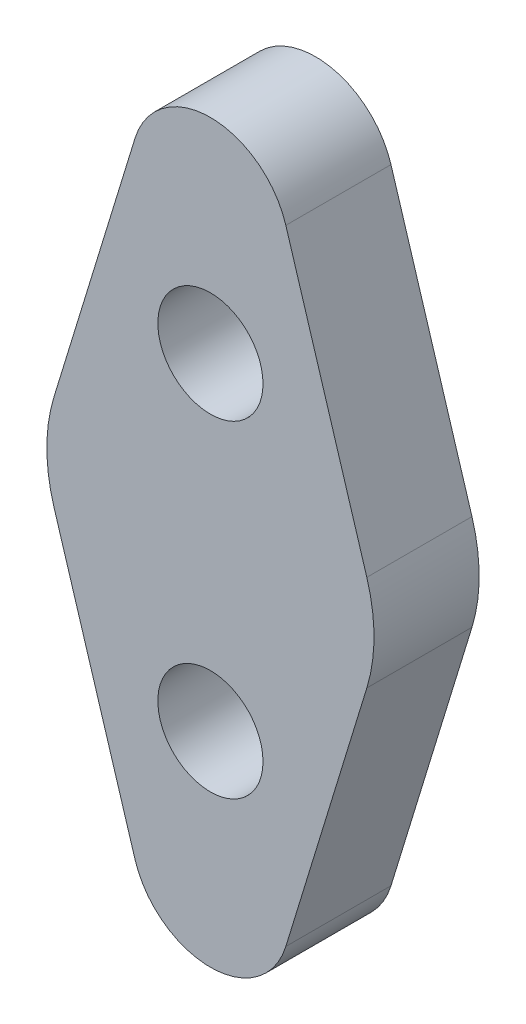
ISO-10303-21;
HEADER;
FILE_DESCRIPTION(('STEP AP214'),'2;1');
FILE_NAME('part.step','',(''),(''),'','','');
FILE_SCHEMA(('AUTOMOTIVE_DESIGN { 1 0 10303 214 1 1 1 1 }'));
ENDSEC;
DATA;
#1=APPLICATION_CONTEXT('core data for automotive mechanical design processes');
#2=APPLICATION_PROTOCOL_DEFINITION('international standard','automotive_design',2000,#1);
#3=PRODUCT_CONTEXT('',#1,'mechanical');
#4=PRODUCT('Part','Part','',(#3));
#5=PRODUCT_RELATED_PRODUCT_CATEGORY('part','',(#4));
#6=PRODUCT_DEFINITION_FORMATION('','',#4);
#7=PRODUCT_DEFINITION_CONTEXT('part definition',#1,'design');
#8=PRODUCT_DEFINITION('design','',#6,#7);
#9=PRODUCT_DEFINITION_SHAPE('','',#8);
#10=(LENGTH_UNIT() NAMED_UNIT(*) SI_UNIT(.MILLI.,.METRE.));
#11=(NAMED_UNIT(*) PLANE_ANGLE_UNIT() SI_UNIT($,.RADIAN.));
#12=(NAMED_UNIT(*) SI_UNIT($,.STERADIAN.) SOLID_ANGLE_UNIT());
#13=UNCERTAINTY_MEASURE_WITH_UNIT(LENGTH_MEASURE(1.E-05),#10,'distance_accuracy_value','');
#14=(GEOMETRIC_REPRESENTATION_CONTEXT(3) GLOBAL_UNCERTAINTY_ASSIGNED_CONTEXT((#13)) GLOBAL_UNIT_ASSIGNED_CONTEXT((#10,
#11,#12)) REPRESENTATION_CONTEXT('',''));
#15=CARTESIAN_POINT('',(0.,0.,0.));
#16=DIRECTION('',(0.,0.,1.));
#17=DIRECTION('',(1.,0.,0.));
#18=AXIS2_PLACEMENT_3D('',#15,#16,#17);
#19=CARTESIAN_POINT('',(2.89698820488127E-13,0.,10.));
#20=DIRECTION('',(0.,0.,-1.));
#21=DIRECTION('',(-1.,0.,0.));
#22=AXIS2_PLACEMENT_3D('',#19,#20,#21);
#23=PLANE('',#22);
#24=CARTESIAN_POINT('',(2.89698820488127E-13,0.,10.));
#25=DIRECTION('',(0.,0.,1.));
#26=DIRECTION('',(-1.,0.,0.));
#27=AXIS2_PLACEMENT_3D('',#24,#25,#26);
#28=CIRCLE('',#27,15.5555525832096);
#29=CARTESIAN_POINT('',(-14.8731948831809,4.55667533799713,10.));
#30=VERTEX_POINT('',#29);
#31=CARTESIAN_POINT('',(-14.8731948831809,-4.55667533799713,10.));
#32=VERTEX_POINT('',#31);
#33=EDGE_CURVE('E151',#30,#32,#28,.T.);
#34=ORIENTED_EDGE('',*,*,#33,.T.);
#35=DIRECTION('',(0.292929184843977,-0.956134139473454,0.));
#36=VECTOR('',#35,1.);
#37=CARTESIAN_POINT('',(-14.8731948831809,-4.55667533799713,10.));
#38=LINE('',#37,#36);
#39=CARTESIAN_POINT('',(-7.1710060460509,-29.6969688863298,10.));
#40=VERTEX_POINT('',#39);
#41=EDGE_CURVE('E99',#32,#40,#38,.T.);
#42=ORIENTED_EDGE('',*,*,#41,.T.);
#43=CARTESIAN_POINT('',(0.,-27.5,10.));
#44=DIRECTION('',(0.,0.,1.));
#45=DIRECTION('',(1.,0.,0.));
#46=AXIS2_PLACEMENT_3D('',#43,#44,#45);
#47=CIRCLE('',#46,7.5);
#48=CARTESIAN_POINT('',(7.17100604605091,-29.6969688863298,10.));
#49=VERTEX_POINT('',#48);
#50=EDGE_CURVE('E166',#40,#49,#47,.T.);
#51=ORIENTED_EDGE('',*,*,#50,.T.);
#52=DIRECTION('',(0.292929184843976,0.956134139473455,0.));
#53=VECTOR('',#52,1.);
#54=CARTESIAN_POINT('',(14.8731948831809,-4.55667533799712,10.));
#55=LINE('',#54,#53);
#56=CARTESIAN_POINT('',(14.8731948831809,-4.55667533799712,10.));
#57=VERTEX_POINT('',#56);
#58=EDGE_CURVE('E179',#49,#57,#55,.T.);
#59=ORIENTED_EDGE('',*,*,#58,.T.);
#60=CARTESIAN_POINT('',(0.,0.,10.));
#61=DIRECTION('',(0.,0.,1.));
#62=DIRECTION('',(-1.,0.,0.));
#63=AXIS2_PLACEMENT_3D('',#60,#61,#62);
#64=CIRCLE('',#63,15.5555525832093);
#65=CARTESIAN_POINT('',(14.8731948831809,4.55667533799713,10.));
#66=VERTEX_POINT('',#65);
#67=EDGE_CURVE('E118',#57,#66,#64,.T.);
#68=ORIENTED_EDGE('',*,*,#67,.T.);
#69=DIRECTION('',(-0.292929184843976,0.956134139473455,0.));
#70=VECTOR('',#69,1.);
#71=CARTESIAN_POINT('',(7.17100604605091,29.6969688863298,10.));
#72=LINE('',#71,#70);
#73=CARTESIAN_POINT('',(7.17100604605091,29.6969688863298,10.));
#74=VERTEX_POINT('',#73);
#75=EDGE_CURVE('E112',#66,#74,#72,.T.);
#76=ORIENTED_EDGE('',*,*,#75,.T.);
#77=CARTESIAN_POINT('',(0.,27.5,10.));
#78=DIRECTION('',(0.,0.,1.));
#79=DIRECTION('',(1.,0.,0.));
#80=AXIS2_PLACEMENT_3D('',#77,#78,#79);
#81=CIRCLE('',#80,7.5);
#82=CARTESIAN_POINT('',(-7.1710060460509,29.6969688863298,10.));
#83=VERTEX_POINT('',#82);
#84=EDGE_CURVE('E116',#74,#83,#81,.T.);
#85=ORIENTED_EDGE('',*,*,#84,.T.);
#86=DIRECTION('',(-0.292929184843977,-0.956134139473454,0.));
#87=VECTOR('',#86,1.);
#88=CARTESIAN_POINT('',(-14.8731948831809,4.55667533799713,10.));
#89=LINE('',#88,#87);
#90=EDGE_CURVE('E56',#83,#30,#89,.T.);
#91=ORIENTED_EDGE('',*,*,#90,.T.);
#92=EDGE_LOOP('',(#34,#42,#51,#59,#68,#76,#85,#91));
#93=FACE_BOUND('',#92,.T.);
#94=CARTESIAN_POINT('',(0.,15.5555525832094,10.));
#95=DIRECTION('',(0.,0.,1.));
#96=DIRECTION('',(1.,0.,0.));
#97=AXIS2_PLACEMENT_3D('',#94,#95,#96);
#98=CIRCLE('',#97,5.);
#99=CARTESIAN_POINT('',(5.,15.5555525832094,10.));
#100=VERTEX_POINT('',#99);
#101=EDGE_CURVE('E140',#100,#100,#98,.T.);
#102=ORIENTED_EDGE('',*,*,#101,.F.);
#103=EDGE_LOOP('',(#102));
#104=FACE_BOUND('',#103,.T.);
#105=CARTESIAN_POINT('',(0.,-15.5555525832094,10.));
#106=DIRECTION('',(0.,0.,1.));
#107=DIRECTION('',(1.,0.,0.));
#108=AXIS2_PLACEMENT_3D('',#105,#106,#107);
#109=CIRCLE('',#108,5.);
#110=CARTESIAN_POINT('',(5.,-15.5555525832094,10.));
#111=VERTEX_POINT('',#110);
#112=EDGE_CURVE('E188',#111,#111,#109,.T.);
#113=ORIENTED_EDGE('',*,*,#112,.F.);
#114=EDGE_LOOP('',(#113));
#115=FACE_BOUND('',#114,.T.);
#116=ADVANCED_FACE('F39',(#93,#104,#115),#23,.F.);
#117=CARTESIAN_POINT('',(2.89698820488127E-13,0.,0.));
#118=DIRECTION('',(0.,0.,-1.));
#119=DIRECTION('',(-1.,0.,0.));
#120=AXIS2_PLACEMENT_3D('',#117,#118,#119);
#121=PLANE('',#120);
#122=CARTESIAN_POINT('',(0.,15.5555525832094,0.));
#123=DIRECTION('',(0.,0.,1.));
#124=DIRECTION('',(1.,0.,0.));
#125=AXIS2_PLACEMENT_3D('',#122,#123,#124);
#126=CIRCLE('',#125,5.);
#127=CARTESIAN_POINT('',(5.,15.5555525832094,0.));
#128=VERTEX_POINT('',#127);
#129=EDGE_CURVE('E185',#128,#128,#126,.T.);
#130=ORIENTED_EDGE('',*,*,#129,.T.);
#131=EDGE_LOOP('',(#130));
#132=FACE_BOUND('',#131,.T.);
#133=CARTESIAN_POINT('',(2.89698820488127E-13,0.,0.));
#134=DIRECTION('',(0.,0.,1.));
#135=DIRECTION('',(-1.,0.,0.));
#136=AXIS2_PLACEMENT_3D('',#133,#134,#135);
#137=CIRCLE('',#136,15.5555525832096);
#138=CARTESIAN_POINT('',(-14.8731948831809,4.55667533799713,0.));
#139=VERTEX_POINT('',#138);
#140=CARTESIAN_POINT('',(-14.8731948831809,-4.55667533799713,0.));
#141=VERTEX_POINT('',#140);
#142=EDGE_CURVE('E136',#139,#141,#137,.T.);
#143=ORIENTED_EDGE('',*,*,#142,.F.);
#144=DIRECTION('',(-0.292929184843977,-0.956134139473454,0.));
#145=VECTOR('',#144,1.);
#146=CARTESIAN_POINT('',(-14.8731948831809,4.55667533799713,0.));
#147=LINE('',#146,#145);
#148=CARTESIAN_POINT('',(-7.1710060460509,29.6969688863298,0.));
#149=VERTEX_POINT('',#148);
#150=EDGE_CURVE('E91',#149,#139,#147,.T.);
#151=ORIENTED_EDGE('',*,*,#150,.F.);
#152=CARTESIAN_POINT('',(0.,27.5,0.));
#153=DIRECTION('',(0.,0.,1.));
#154=DIRECTION('',(1.,0.,0.));
#155=AXIS2_PLACEMENT_3D('',#152,#153,#154);
#156=CIRCLE('',#155,7.5);
#157=CARTESIAN_POINT('',(7.17100604605091,29.6969688863298,0.));
#158=VERTEX_POINT('',#157);
#159=EDGE_CURVE('E85',#158,#149,#156,.T.);
#160=ORIENTED_EDGE('',*,*,#159,.F.);
#161=DIRECTION('',(-0.292929184843976,0.956134139473455,0.));
#162=VECTOR('',#161,1.);
#163=CARTESIAN_POINT('',(7.17100604605091,29.6969688863298,0.));
#164=LINE('',#163,#162);
#165=CARTESIAN_POINT('',(14.8731948831809,4.55667533799713,0.));
#166=VERTEX_POINT('',#165);
#167=EDGE_CURVE('E126',#166,#158,#164,.T.);
#168=ORIENTED_EDGE('',*,*,#167,.F.);
#169=CARTESIAN_POINT('',(0.,0.,0.));
#170=DIRECTION('',(0.,0.,1.));
#171=DIRECTION('',(-1.,0.,0.));
#172=AXIS2_PLACEMENT_3D('',#169,#170,#171);
#173=CIRCLE('',#172,15.5555525832093);
#174=CARTESIAN_POINT('',(14.8731948831809,-4.55667533799712,0.));
#175=VERTEX_POINT('',#174);
#176=EDGE_CURVE('E146',#175,#166,#173,.T.);
#177=ORIENTED_EDGE('',*,*,#176,.F.);
#178=DIRECTION('',(0.292929184843976,0.956134139473455,0.));
#179=VECTOR('',#178,1.);
#180=CARTESIAN_POINT('',(14.8731948831809,-4.55667533799712,0.));
#181=LINE('',#180,#179);
#182=CARTESIAN_POINT('',(7.17100604605091,-29.6969688863298,0.));
#183=VERTEX_POINT('',#182);
#184=EDGE_CURVE('E144',#183,#175,#181,.T.);
#185=ORIENTED_EDGE('',*,*,#184,.F.);
#186=CARTESIAN_POINT('',(0.,-27.5,0.));
#187=DIRECTION('',(0.,0.,1.));
#188=DIRECTION('',(1.,0.,0.));
#189=AXIS2_PLACEMENT_3D('',#186,#187,#188);
#190=CIRCLE('',#189,7.5);
#191=CARTESIAN_POINT('',(-7.1710060460509,-29.6969688863298,0.));
#192=VERTEX_POINT('',#191);
#193=EDGE_CURVE('E142',#192,#183,#190,.T.);
#194=ORIENTED_EDGE('',*,*,#193,.F.);
#195=DIRECTION('',(0.292929184843977,-0.956134139473454,0.));
#196=VECTOR('',#195,1.);
#197=CARTESIAN_POINT('',(-14.8731948831809,-4.55667533799713,0.));
#198=LINE('',#197,#196);
#199=EDGE_CURVE('E139',#141,#192,#198,.T.);
#200=ORIENTED_EDGE('',*,*,#199,.F.);
#201=EDGE_LOOP('',(#143,#151,#160,#168,#177,#185,#194,#200));
#202=FACE_BOUND('',#201,.T.);
#203=CARTESIAN_POINT('',(0.,-15.5555525832094,0.));
#204=DIRECTION('',(0.,0.,1.));
#205=DIRECTION('',(1.,0.,0.));
#206=AXIS2_PLACEMENT_3D('',#203,#204,#205);
#207=CIRCLE('',#206,5.);
#208=CARTESIAN_POINT('',(5.,-15.5555525832094,0.));
#209=VERTEX_POINT('',#208);
#210=EDGE_CURVE('E191',#209,#209,#207,.T.);
#211=ORIENTED_EDGE('',*,*,#210,.T.);
#212=EDGE_LOOP('',(#211));
#213=FACE_BOUND('',#212,.T.);
#214=ADVANCED_FACE('F170',(#132,#202,#213),#121,.T.);
#215=CARTESIAN_POINT('',(2.89698820488127E-13,0.,10.));
#216=DIRECTION('',(0.,0.,-1.));
#217=DIRECTION('',(-1.,0.,0.));
#218=AXIS2_PLACEMENT_3D('',#215,#216,#217);
#219=CYLINDRICAL_SURFACE('',#218,15.5555525832096);
#220=ORIENTED_EDGE('',*,*,#142,.T.);
#221=DIRECTION('',(0.,0.,-1.));
#222=VECTOR('',#221,1.);
#223=CARTESIAN_POINT('',(-14.8731948831809,-4.55667533799713,10.));
#224=LINE('',#223,#222);
#225=EDGE_CURVE('E11',#32,#141,#224,.T.);
#226=ORIENTED_EDGE('',*,*,#225,.F.);
#227=ORIENTED_EDGE('',*,*,#33,.F.);
#228=DIRECTION('',(0.,0.,-1.));
#229=VECTOR('',#228,1.);
#230=CARTESIAN_POINT('',(-14.8731948831809,4.55667533799713,10.));
#231=LINE('',#230,#229);
#232=EDGE_CURVE('E132',#30,#139,#231,.T.);
#233=ORIENTED_EDGE('',*,*,#232,.T.);
#234=EDGE_LOOP('',(#220,#226,#227,#233));
#235=FACE_BOUND('',#234,.T.);
#236=ADVANCED_FACE('F41',(#235),#219,.T.);
#237=CARTESIAN_POINT('',(-14.8731948831809,-4.55667533799713,10.));
#238=DIRECTION('',(0.956134139473454,0.292929184843977,0.));
#239=DIRECTION('',(-0.292929184843977,0.956134139473454,0.));
#240=AXIS2_PLACEMENT_3D('',#237,#238,#239);
#241=PLANE('',#240);
#242=ORIENTED_EDGE('',*,*,#199,.T.);
#243=DIRECTION('',(0.,0.,-1.));
#244=VECTOR('',#243,1.);
#245=CARTESIAN_POINT('',(-7.1710060460509,-29.6969688863298,10.));
#246=LINE('',#245,#244);
#247=EDGE_CURVE('E48',#40,#192,#246,.T.);
#248=ORIENTED_EDGE('',*,*,#247,.F.);
#249=ORIENTED_EDGE('',*,*,#41,.F.);
#250=ORIENTED_EDGE('',*,*,#225,.T.);
#251=EDGE_LOOP('',(#242,#248,#249,#250));
#252=FACE_BOUND('',#251,.T.);
#253=ADVANCED_FACE('F223',(#252),#241,.F.);
#254=CARTESIAN_POINT('',(0.,-27.5,10.));
#255=DIRECTION('',(0.,0.,-1.));
#256=DIRECTION('',(-1.,0.,0.));
#257=AXIS2_PLACEMENT_3D('',#254,#255,#256);
#258=CYLINDRICAL_SURFACE('',#257,7.5);
#259=ORIENTED_EDGE('',*,*,#193,.T.);
#260=DIRECTION('',(0.,0.,-1.));
#261=VECTOR('',#260,1.);
#262=CARTESIAN_POINT('',(7.17100604605091,-29.6969688863298,10.));
#263=LINE('',#262,#261);
#264=EDGE_CURVE('E158',#49,#183,#263,.T.);
#265=ORIENTED_EDGE('',*,*,#264,.F.);
#266=ORIENTED_EDGE('',*,*,#50,.F.);
#267=ORIENTED_EDGE('',*,*,#247,.T.);
#268=EDGE_LOOP('',(#259,#265,#266,#267));
#269=FACE_BOUND('',#268,.T.);
#270=ADVANCED_FACE('F164',(#269),#258,.T.);
#271=CARTESIAN_POINT('',(14.8731948831809,-4.55667533799712,10.));
#272=DIRECTION('',(-0.956134139473455,0.292929184843976,0.));
#273=DIRECTION('',(-0.292929184843976,-0.956134139473455,0.));
#274=AXIS2_PLACEMENT_3D('',#271,#272,#273);
#275=PLANE('',#274);
#276=ORIENTED_EDGE('',*,*,#184,.T.);
#277=DIRECTION('',(0.,0.,-1.));
#278=VECTOR('',#277,1.);
#279=CARTESIAN_POINT('',(14.8731948831809,-4.55667533799712,10.));
#280=LINE('',#279,#278);
#281=EDGE_CURVE('E155',#57,#175,#280,.T.);
#282=ORIENTED_EDGE('',*,*,#281,.F.);
#283=ORIENTED_EDGE('',*,*,#58,.F.);
#284=ORIENTED_EDGE('',*,*,#264,.T.);
#285=EDGE_LOOP('',(#276,#282,#283,#284));
#286=FACE_BOUND('',#285,.T.);
#287=ADVANCED_FACE('F175',(#286),#275,.F.);
#288=CARTESIAN_POINT('',(0.,0.,10.));
#289=DIRECTION('',(0.,0.,-1.));
#290=DIRECTION('',(-1.,0.,0.));
#291=AXIS2_PLACEMENT_3D('',#288,#289,#290);
#292=CYLINDRICAL_SURFACE('',#291,15.5555525832093);
#293=ORIENTED_EDGE('',*,*,#176,.T.);
#294=DIRECTION('',(0.,0.,-1.));
#295=VECTOR('',#294,1.);
#296=CARTESIAN_POINT('',(14.8731948831809,4.55667533799713,10.));
#297=LINE('',#296,#295);
#298=EDGE_CURVE('E127',#66,#166,#297,.T.);
#299=ORIENTED_EDGE('',*,*,#298,.F.);
#300=ORIENTED_EDGE('',*,*,#67,.F.);
#301=ORIENTED_EDGE('',*,*,#281,.T.);
#302=EDGE_LOOP('',(#293,#299,#300,#301));
#303=FACE_BOUND('',#302,.T.);
#304=ADVANCED_FACE('F178',(#303),#292,.T.);
#305=CARTESIAN_POINT('',(7.17100604605091,29.6969688863298,10.));
#306=DIRECTION('',(-0.956134139473455,-0.292929184843976,0.));
#307=DIRECTION('',(0.292929184843976,-0.956134139473455,0.));
#308=AXIS2_PLACEMENT_3D('',#305,#306,#307);
#309=PLANE('',#308);
#310=ORIENTED_EDGE('',*,*,#167,.T.);
#311=DIRECTION('',(0.,0.,-1.));
#312=VECTOR('',#311,1.);
#313=CARTESIAN_POINT('',(7.17100604605091,29.6969688863298,10.));
#314=LINE('',#313,#312);
#315=EDGE_CURVE('E123',#74,#158,#314,.T.);
#316=ORIENTED_EDGE('',*,*,#315,.F.);
#317=ORIENTED_EDGE('',*,*,#75,.F.);
#318=ORIENTED_EDGE('',*,*,#298,.T.);
#319=EDGE_LOOP('',(#310,#316,#317,#318));
#320=FACE_BOUND('',#319,.T.);
#321=ADVANCED_FACE('F124',(#320),#309,.F.);
#322=CARTESIAN_POINT('',(0.,27.5,10.));
#323=DIRECTION('',(0.,0.,-1.));
#324=DIRECTION('',(-1.,0.,0.));
#325=AXIS2_PLACEMENT_3D('',#322,#323,#324);
#326=CYLINDRICAL_SURFACE('',#325,7.5);
#327=ORIENTED_EDGE('',*,*,#159,.T.);
#328=DIRECTION('',(0.,0.,-1.));
#329=VECTOR('',#328,1.);
#330=CARTESIAN_POINT('',(-7.1710060460509,29.6969688863298,10.));
#331=LINE('',#330,#329);
#332=EDGE_CURVE('E128',#83,#149,#331,.T.);
#333=ORIENTED_EDGE('',*,*,#332,.F.);
#334=ORIENTED_EDGE('',*,*,#84,.F.);
#335=ORIENTED_EDGE('',*,*,#315,.T.);
#336=EDGE_LOOP('',(#327,#333,#334,#335));
#337=FACE_BOUND('',#336,.T.);
#338=ADVANCED_FACE('F130',(#337),#326,.T.);
#339=CARTESIAN_POINT('',(-14.8731948831809,4.55667533799713,10.));
#340=DIRECTION('',(0.956134139473454,-0.292929184843977,0.));
#341=DIRECTION('',(0.292929184843977,0.956134139473454,0.));
#342=AXIS2_PLACEMENT_3D('',#339,#340,#341);
#343=PLANE('',#342);
#344=ORIENTED_EDGE('',*,*,#150,.T.);
#345=ORIENTED_EDGE('',*,*,#232,.F.);
#346=ORIENTED_EDGE('',*,*,#90,.F.);
#347=ORIENTED_EDGE('',*,*,#332,.T.);
#348=EDGE_LOOP('',(#344,#345,#346,#347));
#349=FACE_BOUND('',#348,.T.);
#350=ADVANCED_FACE('F211',(#349),#343,.F.);
#351=CARTESIAN_POINT('',(0.,15.5555525832094,10.));
#352=DIRECTION('',(0.,0.,-1.));
#353=DIRECTION('',(-1.,0.,0.));
#354=AXIS2_PLACEMENT_3D('',#351,#352,#353);
#355=CYLINDRICAL_SURFACE('',#354,5.);
#356=ORIENTED_EDGE('',*,*,#101,.T.);
#357=EDGE_LOOP('',(#356));
#358=FACE_BOUND('',#357,.T.);
#359=ORIENTED_EDGE('',*,*,#129,.F.);
#360=EDGE_LOOP('',(#359));
#361=FACE_BOUND('',#360,.T.);
#362=ADVANCED_FACE('F208',(#358,#361),#355,.F.);
#363=CARTESIAN_POINT('',(0.,-15.5555525832094,10.));
#364=DIRECTION('',(0.,0.,-1.));
#365=DIRECTION('',(-1.,0.,0.));
#366=AXIS2_PLACEMENT_3D('',#363,#364,#365);
#367=CYLINDRICAL_SURFACE('',#366,5.);
#368=ORIENTED_EDGE('',*,*,#112,.T.);
#369=EDGE_LOOP('',(#368));
#370=FACE_BOUND('',#369,.T.);
#371=ORIENTED_EDGE('',*,*,#210,.F.);
#372=EDGE_LOOP('',(#371));
#373=FACE_BOUND('',#372,.T.);
#374=ADVANCED_FACE('F197',(#370,#373),#367,.F.);
#375=CLOSED_SHELL('',(#116,#214,#236,#253,#270,#287,#304,#321,#338,#350,#362,#374));
#376=MANIFOLD_SOLID_BREP('B2',#375);
#377=ADVANCED_BREP_SHAPE_REPRESENTATION('',(#18,#376),#14);
#378=SHAPE_DEFINITION_REPRESENTATION(#9,#377);
ENDSEC;
END-ISO-10303-21;
